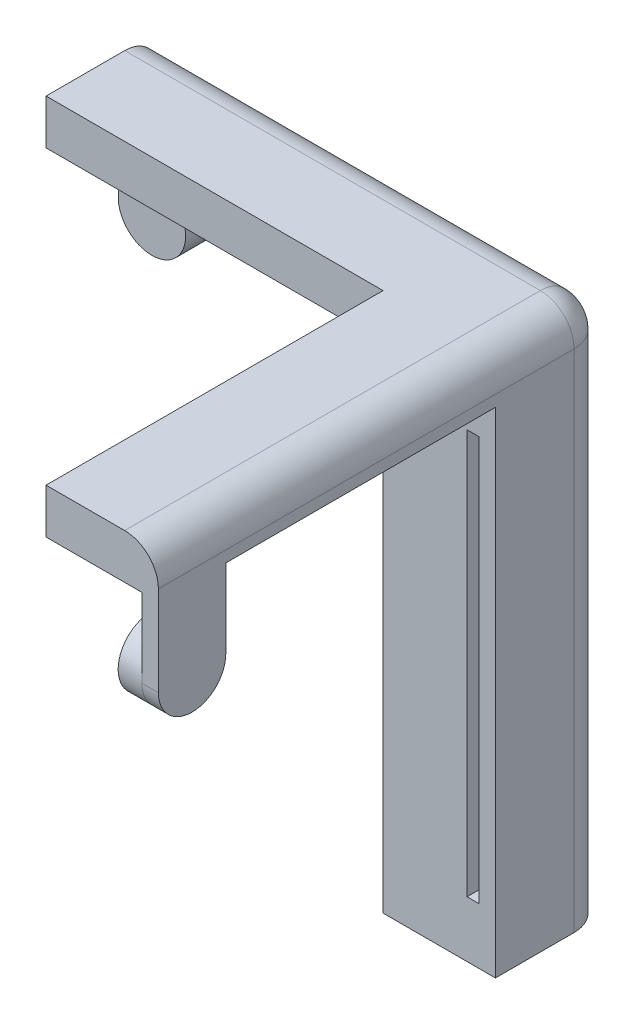
ISO-10303-21;
HEADER;
FILE_DESCRIPTION(('STEP AP214'),'2;1');
FILE_NAME('part.step','',(''),(''),'','','');
FILE_SCHEMA(('AUTOMOTIVE_DESIGN { 1 0 10303 214 1 1 1 1 }'));
ENDSEC;
DATA;
#1=APPLICATION_CONTEXT('core data for automotive mechanical design processes');
#2=APPLICATION_PROTOCOL_DEFINITION('international standard','automotive_design',2000,#1);
#3=PRODUCT_CONTEXT('',#1,'mechanical');
#4=PRODUCT('Part','Part','',(#3));
#5=PRODUCT_RELATED_PRODUCT_CATEGORY('part','',(#4));
#6=PRODUCT_DEFINITION_FORMATION('','',#4);
#7=PRODUCT_DEFINITION_CONTEXT('part definition',#1,'design');
#8=PRODUCT_DEFINITION('design','',#6,#7);
#9=PRODUCT_DEFINITION_SHAPE('','',#8);
#10=(LENGTH_UNIT() NAMED_UNIT(*) SI_UNIT(.MILLI.,.METRE.));
#11=(NAMED_UNIT(*) PLANE_ANGLE_UNIT() SI_UNIT($,.RADIAN.));
#12=(NAMED_UNIT(*) SI_UNIT($,.STERADIAN.) SOLID_ANGLE_UNIT());
#13=UNCERTAINTY_MEASURE_WITH_UNIT(LENGTH_MEASURE(1.E-05),#10,'distance_accuracy_value','');
#14=(GEOMETRIC_REPRESENTATION_CONTEXT(3) GLOBAL_UNCERTAINTY_ASSIGNED_CONTEXT((#13)) GLOBAL_UNIT_ASSIGNED_CONTEXT((#10,
#11,#12)) REPRESENTATION_CONTEXT('',''));
#15=CARTESIAN_POINT('',(0.,0.,0.));
#16=DIRECTION('',(0.,0.,1.));
#17=DIRECTION('',(1.,0.,0.));
#18=AXIS2_PLACEMENT_3D('',#15,#16,#17);
#19=CARTESIAN_POINT('',(0.,139.7,0.));
#20=DIRECTION('',(0.,1.,0.));
#21=DIRECTION('',(0.,0.,1.));
#22=AXIS2_PLACEMENT_3D('',#19,#20,#21);
#23=PLANE('',#22);
#24=DIRECTION('',(-1.,0.,0.));
#25=VECTOR('',#24,1.);
#26=CARTESIAN_POINT('',(-25.4,139.7,-15.875));
#27=LINE('',#26,#25);
#28=CARTESIAN_POINT('',(-3.175,139.7,-15.875));
#29=VERTEX_POINT('',#28);
#30=CARTESIAN_POINT('',(-25.4,139.7,-15.875));
#31=VERTEX_POINT('',#30);
#32=EDGE_CURVE('E295',#29,#31,#27,.T.);
#33=ORIENTED_EDGE('',*,*,#32,.F.);
#34=CARTESIAN_POINT('',(-3.175,139.7,-6.35));
#35=DIRECTION('',(0.,1.,0.));
#36=DIRECTION('',(0.,0.,1.));
#37=AXIS2_PLACEMENT_3D('',#34,#35,#36);
#38=CIRCLE('',#37,9.525);
#39=CARTESIAN_POINT('',(6.35,139.7,-6.35));
#40=VERTEX_POINT('',#39);
#41=EDGE_CURVE('E11',#29,#40,#38,.F.);
#42=ORIENTED_EDGE('',*,*,#41,.T.);
#43=DIRECTION('',(0.,0.,1.));
#44=VECTOR('',#43,1.);
#45=CARTESIAN_POINT('',(6.35,139.7,0.));
#46=LINE('',#45,#44);
#47=CARTESIAN_POINT('',(6.35,139.7,15.875));
#48=VERTEX_POINT('',#47);
#49=EDGE_CURVE('E42',#40,#48,#46,.T.);
#50=ORIENTED_EDGE('',*,*,#49,.T.);
#51=DIRECTION('',(1.,0.,0.));
#52=VECTOR('',#51,1.);
#53=CARTESIAN_POINT('',(-25.4,139.7,15.875));
#54=LINE('',#53,#52);
#55=CARTESIAN_POINT('',(-25.4,139.7,15.875));
#56=VERTEX_POINT('',#55);
#57=EDGE_CURVE('E296',#56,#48,#54,.T.);
#58=ORIENTED_EDGE('',*,*,#57,.F.);
#59=DIRECTION('',(0.,0.,1.));
#60=VECTOR('',#59,1.);
#61=CARTESIAN_POINT('',(-25.4,139.7,15.875));
#62=LINE('',#61,#60);
#63=EDGE_CURVE('E37',#31,#56,#62,.T.);
#64=ORIENTED_EDGE('',*,*,#63,.F.);
#65=EDGE_LOOP('',(#33,#42,#50,#58,#64));
#66=FACE_BOUND('',#65,.T.);
#67=ADVANCED_FACE('F34',(#66),#23,.F.);
#68=CARTESIAN_POINT('',(-25.4,279.4,-15.875));
#69=DIRECTION('',(0.,0.,1.));
#70=DIRECTION('',(1.,0.,0.));
#71=AXIS2_PLACEMENT_3D('',#68,#69,#70);
#72=PLANE('',#71);
#73=DIRECTION('',(0.,1.,0.));
#74=VECTOR('',#73,1.);
#75=CARTESIAN_POINT('',(-3.175,0.,-15.875));
#76=LINE('',#75,#74);
#77=CARTESIAN_POINT('',(-3.175,282.575,-15.875));
#78=VERTEX_POINT('',#77);
#79=EDGE_CURVE('E275',#78,#29,#76,.F.);
#80=ORIENTED_EDGE('',*,*,#79,.T.);
#81=ORIENTED_EDGE('',*,*,#32,.T.);
#82=DIRECTION('',(0.,-1.,0.));
#83=VECTOR('',#82,1.);
#84=CARTESIAN_POINT('',(-25.4,279.4,-15.875));
#85=LINE('',#84,#83);
#86=CARTESIAN_POINT('',(-25.4,279.4,-15.875));
#87=VERTEX_POINT('',#86);
#88=EDGE_CURVE('E302',#87,#31,#85,.T.);
#89=ORIENTED_EDGE('',*,*,#88,.F.);
#90=DIRECTION('',(-1.,0.,0.));
#91=VECTOR('',#90,1.);
#92=CARTESIAN_POINT('',(0.,279.4,-15.875));
#93=LINE('',#92,#91);
#94=CARTESIAN_POINT('',(-101.6,279.4,-15.875));
#95=VERTEX_POINT('',#94);
#96=EDGE_CURVE('E381',#87,#95,#93,.T.);
#97=ORIENTED_EDGE('',*,*,#96,.T.);
#98=DIRECTION('',(0.,-1.,0.));
#99=VECTOR('',#98,1.);
#100=CARTESIAN_POINT('',(-101.6,279.4,-15.875));
#101=LINE('',#100,#99);
#102=CARTESIAN_POINT('',(-101.6,257.175,-15.875));
#103=VERTEX_POINT('',#102);
#104=EDGE_CURVE('E249',#95,#103,#101,.T.);
#105=ORIENTED_EDGE('',*,*,#104,.T.);
#106=CARTESIAN_POINT('',(-111.125,257.175,-15.875));
#107=DIRECTION('',(0.,0.,1.));
#108=DIRECTION('',(1.,0.,0.));
#109=AXIS2_PLACEMENT_3D('',#106,#107,#108);
#110=CIRCLE('',#109,9.525);
#111=CARTESIAN_POINT('',(-111.125,247.65,-15.875));
#112=VERTEX_POINT('',#111);
#113=EDGE_CURVE('E229',#103,#112,#110,.F.);
#114=ORIENTED_EDGE('',*,*,#113,.T.);
#115=CARTESIAN_POINT('',(-111.125,257.175,-15.875));
#116=DIRECTION('',(0.,0.,1.));
#117=DIRECTION('',(1.,0.,0.));
#118=AXIS2_PLACEMENT_3D('',#115,#116,#117);
#119=CIRCLE('',#118,9.525);
#120=CARTESIAN_POINT('',(-120.65,257.175,-15.875));
#121=VERTEX_POINT('',#120);
#122=EDGE_CURVE('E264',#112,#121,#119,.F.);
#123=ORIENTED_EDGE('',*,*,#122,.T.);
#124=DIRECTION('',(0.,-1.,0.));
#125=VECTOR('',#124,1.);
#126=CARTESIAN_POINT('',(-120.65,292.1,-15.875));
#127=LINE('',#126,#125);
#128=CARTESIAN_POINT('',(-120.65,282.575,-15.875));
#129=VERTEX_POINT('',#128);
#130=EDGE_CURVE('E223',#129,#121,#127,.T.);
#131=ORIENTED_EDGE('',*,*,#130,.F.);
#132=DIRECTION('',(-1.,0.,0.));
#133=VECTOR('',#132,1.);
#134=CARTESIAN_POINT('',(6.35,282.575,-15.875));
#135=LINE('',#134,#133);
#136=EDGE_CURVE('E278',#129,#78,#135,.F.);
#137=ORIENTED_EDGE('',*,*,#136,.T.);
#138=EDGE_LOOP('',(#80,#81,#89,#97,#105,#114,#123,#131,#137));
#139=FACE_BOUND('',#138,.T.);
#140=ADVANCED_FACE('F300',(#139),#72,.F.);
#141=CARTESIAN_POINT('',(-25.4,279.4,15.875));
#142=DIRECTION('',(0.,0.,-1.));
#143=DIRECTION('',(-1.,0.,0.));
#144=AXIS2_PLACEMENT_3D('',#141,#142,#143);
#145=PLANE('',#144);
#146=DIRECTION('',(-1.,0.,0.));
#147=VECTOR('',#146,1.);
#148=CARTESIAN_POINT('',(-1.67640000000002,269.875,15.875));
#149=LINE('',#148,#147);
#150=CARTESIAN_POINT('',(1.67640000000002,269.875,15.875));
#151=VERTEX_POINT('',#150);
#152=CARTESIAN_POINT('',(-1.67640000000002,269.875,15.875));
#153=VERTEX_POINT('',#152);
#154=EDGE_CURVE('E452',#151,#153,#149,.T.);
#155=ORIENTED_EDGE('',*,*,#154,.F.);
#156=DIRECTION('',(0.,1.,0.));
#157=VECTOR('',#156,1.);
#158=CARTESIAN_POINT('',(1.67640000000002,155.575,15.875));
#159=LINE('',#158,#157);
#160=CARTESIAN_POINT('',(1.67640000000002,155.575,15.875));
#161=VERTEX_POINT('',#160);
#162=EDGE_CURVE('E436',#161,#151,#159,.T.);
#163=ORIENTED_EDGE('',*,*,#162,.F.);
#164=DIRECTION('',(1.,0.,0.));
#165=VECTOR('',#164,1.);
#166=CARTESIAN_POINT('',(-1.67639999999998,155.575,15.875));
#167=LINE('',#166,#165);
#168=CARTESIAN_POINT('',(-1.67639999999998,155.575,15.875));
#169=VERTEX_POINT('',#168);
#170=EDGE_CURVE('E441',#169,#161,#167,.T.);
#171=ORIENTED_EDGE('',*,*,#170,.F.);
#172=DIRECTION('',(0.,-1.,0.));
#173=VECTOR('',#172,1.);
#174=CARTESIAN_POINT('',(-1.67639999999998,155.575,15.875));
#175=LINE('',#174,#173);
#176=EDGE_CURVE('E455',#153,#169,#175,.T.);
#177=ORIENTED_EDGE('',*,*,#176,.F.);
#178=EDGE_LOOP('',(#155,#163,#171,#177));
#179=FACE_BOUND('',#178,.T.);
#180=DIRECTION('',(0.,-1.,0.));
#181=VECTOR('',#180,1.);
#182=CARTESIAN_POINT('',(-25.4,279.4,15.875));
#183=LINE('',#182,#181);
#184=CARTESIAN_POINT('',(-25.4,279.4,15.875));
#185=VERTEX_POINT('',#184);
#186=EDGE_CURVE('E312',#185,#56,#183,.T.);
#187=ORIENTED_EDGE('',*,*,#186,.T.);
#188=ORIENTED_EDGE('',*,*,#57,.T.);
#189=DIRECTION('',(0.,-1.,0.));
#190=VECTOR('',#189,1.);
#191=CARTESIAN_POINT('',(6.35,279.4,15.875));
#192=LINE('',#191,#190);
#193=CARTESIAN_POINT('',(6.35,279.4,15.875));
#194=VERTEX_POINT('',#193);
#195=EDGE_CURVE('E428',#194,#48,#192,.T.);
#196=ORIENTED_EDGE('',*,*,#195,.F.);
#197=DIRECTION('',(1.,0.,0.));
#198=VECTOR('',#197,1.);
#199=CARTESIAN_POINT('',(-25.4,279.4,15.875));
#200=LINE('',#199,#198);
#201=EDGE_CURVE('E318',#185,#194,#200,.T.);
#202=ORIENTED_EDGE('',*,*,#201,.F.);
#203=EDGE_LOOP('',(#187,#188,#196,#202));
#204=FACE_BOUND('',#203,.T.);
#205=ADVANCED_FACE('F521',(#179,#204),#145,.F.);
#206=CARTESIAN_POINT('',(-25.4,279.4,15.875));
#207=DIRECTION('',(1.,0.,0.));
#208=DIRECTION('',(0.,0.,-1.));
#209=AXIS2_PLACEMENT_3D('',#206,#207,#208);
#210=PLANE('',#209);
#211=DIRECTION('',(0.,0.,1.));
#212=VECTOR('',#211,1.);
#213=CARTESIAN_POINT('',(-25.4,155.575,-11.2014));
#214=LINE('',#213,#212);
#215=CARTESIAN_POINT('',(-25.4,155.575,-11.2014));
#216=VERTEX_POINT('',#215);
#217=CARTESIAN_POINT('',(-25.4,155.575,-7.84859999999999));
#218=VERTEX_POINT('',#217);
#219=EDGE_CURVE('E418',#216,#218,#214,.T.);
#220=ORIENTED_EDGE('',*,*,#219,.F.);
#221=DIRECTION('',(0.,-1.,0.));
#222=VECTOR('',#221,1.);
#223=CARTESIAN_POINT('',(-25.4,269.875,-11.2014));
#224=LINE('',#223,#222);
#225=CARTESIAN_POINT('',(-25.4,269.875,-11.2014));
#226=VERTEX_POINT('',#225);
#227=EDGE_CURVE('E402',#226,#216,#224,.T.);
#228=ORIENTED_EDGE('',*,*,#227,.F.);
#229=DIRECTION('',(0.,0.,-1.));
#230=VECTOR('',#229,1.);
#231=CARTESIAN_POINT('',(-25.4,269.875,-11.2014));
#232=LINE('',#231,#230);
#233=CARTESIAN_POINT('',(-25.4,269.875,-7.8486));
#234=VERTEX_POINT('',#233);
#235=EDGE_CURVE('E407',#234,#226,#232,.T.);
#236=ORIENTED_EDGE('',*,*,#235,.F.);
#237=DIRECTION('',(0.,1.,0.));
#238=VECTOR('',#237,1.);
#239=CARTESIAN_POINT('',(-25.4,269.875,-7.8486));
#240=LINE('',#239,#238);
#241=EDGE_CURVE('E421',#218,#234,#240,.T.);
#242=ORIENTED_EDGE('',*,*,#241,.F.);
#243=EDGE_LOOP('',(#220,#228,#236,#242));
#244=FACE_BOUND('',#243,.T.);
#245=ORIENTED_EDGE('',*,*,#88,.T.);
#246=ORIENTED_EDGE('',*,*,#63,.T.);
#247=ORIENTED_EDGE('',*,*,#186,.F.);
#248=DIRECTION('',(0.,0.,1.));
#249=VECTOR('',#248,1.);
#250=CARTESIAN_POINT('',(-25.4,279.4,15.875));
#251=LINE('',#250,#249);
#252=EDGE_CURVE('E309',#87,#185,#251,.T.);
#253=ORIENTED_EDGE('',*,*,#252,.F.);
#254=EDGE_LOOP('',(#245,#246,#247,#253));
#255=FACE_BOUND('',#254,.T.);
#256=ADVANCED_FACE('F306',(#244,#255),#210,.F.);
#257=CARTESIAN_POINT('',(1.67640000000002,155.575,3.175));
#258=DIRECTION('',(1.,0.,0.));
#259=DIRECTION('',(0.,1.,0.));
#260=AXIS2_PLACEMENT_3D('',#257,#258,#259);
#261=PLANE('',#260);
#262=ORIENTED_EDGE('',*,*,#162,.T.);
#263=DIRECTION('',(0.,0.,1.));
#264=VECTOR('',#263,1.);
#265=CARTESIAN_POINT('',(1.67640000000002,269.875,3.175));
#266=LINE('',#265,#264);
#267=CARTESIAN_POINT('',(1.67640000000002,269.875,3.175));
#268=VERTEX_POINT('',#267);
#269=EDGE_CURVE('E450',#268,#151,#266,.T.);
#270=ORIENTED_EDGE('',*,*,#269,.F.);
#271=DIRECTION('',(0.,1.,0.));
#272=VECTOR('',#271,1.);
#273=CARTESIAN_POINT('',(1.67640000000002,155.575,3.175));
#274=LINE('',#273,#272);
#275=CARTESIAN_POINT('',(1.67640000000002,155.575,3.175));
#276=VERTEX_POINT('',#275);
#277=EDGE_CURVE('E437',#276,#268,#274,.T.);
#278=ORIENTED_EDGE('',*,*,#277,.F.);
#279=DIRECTION('',(0.,0.,1.));
#280=VECTOR('',#279,1.);
#281=CARTESIAN_POINT('',(1.67640000000002,155.575,3.175));
#282=LINE('',#281,#280);
#283=EDGE_CURVE('E460',#276,#161,#282,.T.);
#284=ORIENTED_EDGE('',*,*,#283,.T.);
#285=EDGE_LOOP('',(#262,#270,#278,#284));
#286=FACE_BOUND('',#285,.T.);
#287=ADVANCED_FACE('F559',(#286),#261,.F.);
#288=CARTESIAN_POINT('',(-1.67639999999998,155.575,3.175));
#289=DIRECTION('',(0.,-1.,0.));
#290=DIRECTION('',(0.,0.,-1.));
#291=AXIS2_PLACEMENT_3D('',#288,#289,#290);
#292=PLANE('',#291);
#293=ORIENTED_EDGE('',*,*,#170,.T.);
#294=ORIENTED_EDGE('',*,*,#283,.F.);
#295=DIRECTION('',(1.,0.,0.));
#296=VECTOR('',#295,1.);
#297=CARTESIAN_POINT('',(-1.67639999999998,155.575,3.175));
#298=LINE('',#297,#296);
#299=CARTESIAN_POINT('',(-1.67639999999998,155.575,3.175));
#300=VERTEX_POINT('',#299);
#301=EDGE_CURVE('E447',#300,#276,#298,.T.);
#302=ORIENTED_EDGE('',*,*,#301,.F.);
#303=DIRECTION('',(0.,0.,1.));
#304=VECTOR('',#303,1.);
#305=CARTESIAN_POINT('',(-1.67639999999998,155.575,3.175));
#306=LINE('',#305,#304);
#307=EDGE_CURVE('E462',#300,#169,#306,.T.);
#308=ORIENTED_EDGE('',*,*,#307,.T.);
#309=EDGE_LOOP('',(#293,#294,#302,#308));
#310=FACE_BOUND('',#309,.T.);
#311=ADVANCED_FACE('F566',(#310),#292,.F.);
#312=CARTESIAN_POINT('',(-1.67639999999998,155.575,3.175));
#313=DIRECTION('',(-1.,0.,0.));
#314=DIRECTION('',(0.,-1.,0.));
#315=AXIS2_PLACEMENT_3D('',#312,#313,#314);
#316=PLANE('',#315);
#317=ORIENTED_EDGE('',*,*,#176,.T.);
#318=ORIENTED_EDGE('',*,*,#307,.F.);
#319=DIRECTION('',(0.,-1.,0.));
#320=VECTOR('',#319,1.);
#321=CARTESIAN_POINT('',(-1.67639999999998,155.575,3.175));
#322=LINE('',#321,#320);
#323=CARTESIAN_POINT('',(-1.67640000000002,269.875,3.175));
#324=VERTEX_POINT('',#323);
#325=EDGE_CURVE('E444',#324,#300,#322,.T.);
#326=ORIENTED_EDGE('',*,*,#325,.F.);
#327=DIRECTION('',(0.,0.,1.));
#328=VECTOR('',#327,1.);
#329=CARTESIAN_POINT('',(-1.67640000000002,269.875,3.175));
#330=LINE('',#329,#328);
#331=EDGE_CURVE('E464',#324,#153,#330,.T.);
#332=ORIENTED_EDGE('',*,*,#331,.T.);
#333=EDGE_LOOP('',(#317,#318,#326,#332));
#334=FACE_BOUND('',#333,.T.);
#335=ADVANCED_FACE('F572',(#334),#316,.F.);
#336=CARTESIAN_POINT('',(-1.67640000000002,269.875,3.175));
#337=DIRECTION('',(0.,1.,0.));
#338=DIRECTION('',(0.,0.,1.));
#339=AXIS2_PLACEMENT_3D('',#336,#337,#338);
#340=PLANE('',#339);
#341=ORIENTED_EDGE('',*,*,#154,.T.);
#342=ORIENTED_EDGE('',*,*,#331,.F.);
#343=DIRECTION('',(-1.,0.,0.));
#344=VECTOR('',#343,1.);
#345=CARTESIAN_POINT('',(-1.67640000000002,269.875,3.175));
#346=LINE('',#345,#344);
#347=EDGE_CURVE('E440',#268,#324,#346,.T.);
#348=ORIENTED_EDGE('',*,*,#347,.F.);
#349=ORIENTED_EDGE('',*,*,#269,.T.);
#350=EDGE_LOOP('',(#341,#342,#348,#349));
#351=FACE_BOUND('',#350,.T.);
#352=ADVANCED_FACE('F568',(#351),#340,.F.);
#353=CARTESIAN_POINT('',(0.,0.,3.175));
#354=DIRECTION('',(0.,0.,-1.));
#355=DIRECTION('',(-1.,0.,0.));
#356=AXIS2_PLACEMENT_3D('',#353,#354,#355);
#357=PLANE('',#356);
#358=ORIENTED_EDGE('',*,*,#277,.T.);
#359=ORIENTED_EDGE('',*,*,#347,.T.);
#360=ORIENTED_EDGE('',*,*,#325,.T.);
#361=ORIENTED_EDGE('',*,*,#301,.T.);
#362=EDGE_LOOP('',(#358,#359,#360,#361));
#363=FACE_BOUND('',#362,.T.);
#364=ADVANCED_FACE('F571',(#363),#357,.F.);
#365=CARTESIAN_POINT('',(6.35,0.,0.));
#366=DIRECTION('',(1.,0.,0.));
#367=DIRECTION('',(0.,0.,-1.));
#368=AXIS2_PLACEMENT_3D('',#365,#366,#367);
#369=PLANE('',#368);
#370=ORIENTED_EDGE('',*,*,#49,.F.);
#371=DIRECTION('',(0.,1.,0.));
#372=VECTOR('',#371,1.);
#373=CARTESIAN_POINT('',(6.35,292.1,-6.35));
#374=LINE('',#373,#372);
#375=CARTESIAN_POINT('',(6.35,282.575,-6.35));
#376=VERTEX_POINT('',#375);
#377=EDGE_CURVE('E280',#40,#376,#374,.T.);
#378=ORIENTED_EDGE('',*,*,#377,.T.);
#379=DIRECTION('',(0.,0.,1.));
#380=VECTOR('',#379,1.);
#381=CARTESIAN_POINT('',(6.35,282.575,0.));
#382=LINE('',#381,#380);
#383=CARTESIAN_POINT('',(6.35000000000001,282.575,111.145003851853));
#384=VERTEX_POINT('',#383);
#385=EDGE_CURVE('E282',#376,#384,#382,.T.);
#386=ORIENTED_EDGE('',*,*,#385,.T.);
#387=DIRECTION('',(0.,-1.,0.));
#388=VECTOR('',#387,1.);
#389=CARTESIAN_POINT('',(6.35000000000001,292.1,111.145003851853));
#390=LINE('',#389,#388);
#391=CARTESIAN_POINT('',(6.35000000000001,257.175,111.145003851853));
#392=VERTEX_POINT('',#391);
#393=EDGE_CURVE('E378',#384,#392,#390,.T.);
#394=ORIENTED_EDGE('',*,*,#393,.T.);
#395=CARTESIAN_POINT('',(6.35,257.175,101.620003851853));
#396=DIRECTION('',(1.,0.,0.));
#397=DIRECTION('',(0.,0.,-1.));
#398=AXIS2_PLACEMENT_3D('',#395,#396,#397);
#399=CIRCLE('',#398,9.525);
#400=CARTESIAN_POINT('',(6.35,247.65,101.620003851853));
#401=VERTEX_POINT('',#400);
#402=EDGE_CURVE('E322',#392,#401,#399,.T.);
#403=ORIENTED_EDGE('',*,*,#402,.T.);
#404=CARTESIAN_POINT('',(6.35,257.175,101.620003851853));
#405=DIRECTION('',(1.,0.,0.));
#406=DIRECTION('',(0.,0.,-1.));
#407=AXIS2_PLACEMENT_3D('',#404,#405,#406);
#408=CIRCLE('',#407,9.525);
#409=CARTESIAN_POINT('',(6.35,257.175,92.0950038518526));
#410=VERTEX_POINT('',#409);
#411=EDGE_CURVE('E324',#401,#410,#408,.T.);
#412=ORIENTED_EDGE('',*,*,#411,.T.);
#413=DIRECTION('',(0.,1.,0.));
#414=VECTOR('',#413,1.);
#415=CARTESIAN_POINT('',(6.35,279.4,92.0950038518526));
#416=LINE('',#415,#414);
#417=CARTESIAN_POINT('',(6.35,279.4,92.0950038518526));
#418=VERTEX_POINT('',#417);
#419=EDGE_CURVE('E335',#410,#418,#416,.T.);
#420=ORIENTED_EDGE('',*,*,#419,.T.);
#421=DIRECTION('',(0.,0.,1.));
#422=VECTOR('',#421,1.);
#423=CARTESIAN_POINT('',(6.35,279.4,0.));
#424=LINE('',#423,#422);
#425=EDGE_CURVE('E366',#194,#418,#424,.T.);
#426=ORIENTED_EDGE('',*,*,#425,.F.);
#427=ORIENTED_EDGE('',*,*,#195,.T.);
#428=EDGE_LOOP('',(#370,#378,#386,#394,#403,#412,#420,#426,#427));
#429=FACE_BOUND('',#428,.T.);
#430=ADVANCED_FACE('F474',(#429),#369,.T.);
#431=CARTESIAN_POINT('',(-12.7,269.875,-11.2014));
#432=DIRECTION('',(0.,0.,-1.));
#433=DIRECTION('',(0.,1.,0.));
#434=AXIS2_PLACEMENT_3D('',#431,#432,#433);
#435=PLANE('',#434);
#436=ORIENTED_EDGE('',*,*,#227,.T.);
#437=DIRECTION('',(-1.,0.,0.));
#438=VECTOR('',#437,1.);
#439=CARTESIAN_POINT('',(-12.7,155.575,-11.2014));
#440=LINE('',#439,#438);
#441=CARTESIAN_POINT('',(-12.7,155.575,-11.2014));
#442=VERTEX_POINT('',#441);
#443=EDGE_CURVE('E416',#442,#216,#440,.T.);
#444=ORIENTED_EDGE('',*,*,#443,.F.);
#445=DIRECTION('',(0.,-1.,0.));
#446=VECTOR('',#445,1.);
#447=CARTESIAN_POINT('',(-12.7,269.875,-11.2014));
#448=LINE('',#447,#446);
#449=CARTESIAN_POINT('',(-12.7,269.875,-11.2014));
#450=VERTEX_POINT('',#449);
#451=EDGE_CURVE('E403',#450,#442,#448,.T.);
#452=ORIENTED_EDGE('',*,*,#451,.F.);
#453=DIRECTION('',(-1.,0.,0.));
#454=VECTOR('',#453,1.);
#455=CARTESIAN_POINT('',(-12.7,269.875,-11.2014));
#456=LINE('',#455,#454);
#457=EDGE_CURVE('E426',#450,#226,#456,.T.);
#458=ORIENTED_EDGE('',*,*,#457,.T.);
#459=EDGE_LOOP('',(#436,#444,#452,#458));
#460=FACE_BOUND('',#459,.T.);
#461=ADVANCED_FACE('F584',(#460),#435,.F.);
#462=CARTESIAN_POINT('',(-12.7,269.875,-11.2014));
#463=DIRECTION('',(0.,1.,0.));
#464=DIRECTION('',(0.,0.,1.));
#465=AXIS2_PLACEMENT_3D('',#462,#463,#464);
#466=PLANE('',#465);
#467=ORIENTED_EDGE('',*,*,#235,.T.);
#468=ORIENTED_EDGE('',*,*,#457,.F.);
#469=DIRECTION('',(0.,0.,-1.));
#470=VECTOR('',#469,1.);
#471=CARTESIAN_POINT('',(-12.7,269.875,-11.2014));
#472=LINE('',#471,#470);
#473=CARTESIAN_POINT('',(-12.7,269.875,-7.8486));
#474=VERTEX_POINT('',#473);
#475=EDGE_CURVE('E413',#474,#450,#472,.T.);
#476=ORIENTED_EDGE('',*,*,#475,.F.);
#477=DIRECTION('',(-1.,0.,0.));
#478=VECTOR('',#477,1.);
#479=CARTESIAN_POINT('',(-12.7,269.875,-7.8486));
#480=LINE('',#479,#478);
#481=EDGE_CURVE('E429',#474,#234,#480,.T.);
#482=ORIENTED_EDGE('',*,*,#481,.T.);
#483=EDGE_LOOP('',(#467,#468,#476,#482));
#484=FACE_BOUND('',#483,.T.);
#485=ADVANCED_FACE('F587',(#484),#466,.F.);
#486=CARTESIAN_POINT('',(-12.7,269.875,-7.8486));
#487=DIRECTION('',(0.,0.,1.));
#488=DIRECTION('',(0.,-1.,0.));
#489=AXIS2_PLACEMENT_3D('',#486,#487,#488);
#490=PLANE('',#489);
#491=ORIENTED_EDGE('',*,*,#241,.T.);
#492=ORIENTED_EDGE('',*,*,#481,.F.);
#493=DIRECTION('',(0.,1.,0.));
#494=VECTOR('',#493,1.);
#495=CARTESIAN_POINT('',(-12.7,269.875,-7.8486));
#496=LINE('',#495,#494);
#497=CARTESIAN_POINT('',(-12.7,155.575,-7.84859999999999));
#498=VERTEX_POINT('',#497);
#499=EDGE_CURVE('E410',#498,#474,#496,.T.);
#500=ORIENTED_EDGE('',*,*,#499,.F.);
#501=DIRECTION('',(-1.,0.,0.));
#502=VECTOR('',#501,1.);
#503=CARTESIAN_POINT('',(-12.7,155.575,-7.84859999999999));
#504=LINE('',#503,#502);
#505=EDGE_CURVE('E431',#498,#218,#504,.T.);
#506=ORIENTED_EDGE('',*,*,#505,.T.);
#507=EDGE_LOOP('',(#491,#492,#500,#506));
#508=FACE_BOUND('',#507,.T.);
#509=ADVANCED_FACE('F593',(#508),#490,.F.);
#510=CARTESIAN_POINT('',(-12.7,155.575,-11.2014));
#511=DIRECTION('',(0.,-1.,0.));
#512=DIRECTION('',(0.,0.,-1.));
#513=AXIS2_PLACEMENT_3D('',#510,#511,#512);
#514=PLANE('',#513);
#515=ORIENTED_EDGE('',*,*,#219,.T.);
#516=ORIENTED_EDGE('',*,*,#505,.F.);
#517=DIRECTION('',(0.,0.,1.));
#518=VECTOR('',#517,1.);
#519=CARTESIAN_POINT('',(-12.7,155.575,-11.2014));
#520=LINE('',#519,#518);
#521=EDGE_CURVE('E406',#442,#498,#520,.T.);
#522=ORIENTED_EDGE('',*,*,#521,.F.);
#523=ORIENTED_EDGE('',*,*,#443,.T.);
#524=EDGE_LOOP('',(#515,#516,#522,#523));
#525=FACE_BOUND('',#524,.T.);
#526=ADVANCED_FACE('F589',(#525),#514,.F.);
#527=CARTESIAN_POINT('',(-12.7,0.,0.));
#528=DIRECTION('',(-1.,0.,0.));
#529=DIRECTION('',(0.,0.,1.));
#530=AXIS2_PLACEMENT_3D('',#527,#528,#529);
#531=PLANE('',#530);
#532=ORIENTED_EDGE('',*,*,#451,.T.);
#533=ORIENTED_EDGE('',*,*,#521,.T.);
#534=ORIENTED_EDGE('',*,*,#499,.T.);
#535=ORIENTED_EDGE('',*,*,#475,.T.);
#536=EDGE_LOOP('',(#532,#533,#534,#535));
#537=FACE_BOUND('',#536,.T.);
#538=ADVANCED_FACE('F592',(#537),#531,.T.);
#539=CARTESIAN_POINT('',(0.,279.4,0.));
#540=DIRECTION('',(0.,1.,0.));
#541=DIRECTION('',(0.,0.,1.));
#542=AXIS2_PLACEMENT_3D('',#539,#540,#541);
#543=PLANE('',#542);
#544=DIRECTION('',(1.,0.,0.));
#545=VECTOR('',#544,1.);
#546=CARTESIAN_POINT('',(-120.65,279.4,-11.2014));
#547=LINE('',#546,#545);
#548=CARTESIAN_POINT('',(-120.65,279.4,-11.2014));
#549=VERTEX_POINT('',#548);
#550=CARTESIAN_POINT('',(-101.6,279.4,-11.2014));
#551=VERTEX_POINT('',#550);
#552=EDGE_CURVE('E247',#549,#551,#547,.T.);
#553=ORIENTED_EDGE('',*,*,#552,.T.);
#554=DIRECTION('',(0.,0.,-1.));
#555=VECTOR('',#554,1.);
#556=CARTESIAN_POINT('',(-101.6,279.4,-11.2014));
#557=LINE('',#556,#555);
#558=EDGE_CURVE('E358',#551,#95,#557,.T.);
#559=ORIENTED_EDGE('',*,*,#558,.T.);
#560=ORIENTED_EDGE('',*,*,#96,.F.);
#561=ORIENTED_EDGE('',*,*,#252,.T.);
#562=ORIENTED_EDGE('',*,*,#201,.T.);
#563=ORIENTED_EDGE('',*,*,#425,.T.);
#564=DIRECTION('',(1.,0.,0.));
#565=VECTOR('',#564,1.);
#566=CARTESIAN_POINT('',(1.6764,279.4,92.0950038518526));
#567=LINE('',#566,#565);
#568=CARTESIAN_POINT('',(1.6764,279.4,92.0950038518526));
#569=VERTEX_POINT('',#568);
#570=EDGE_CURVE('E363',#569,#418,#567,.T.);
#571=ORIENTED_EDGE('',*,*,#570,.F.);
#572=DIRECTION('',(0.,0.,1.));
#573=VECTOR('',#572,1.);
#574=CARTESIAN_POINT('',(1.6764,279.4,111.145003851853));
#575=LINE('',#574,#573);
#576=CARTESIAN_POINT('',(1.6764,279.4,111.145003851853));
#577=VERTEX_POINT('',#576);
#578=EDGE_CURVE('E346',#569,#577,#575,.T.);
#579=ORIENTED_EDGE('',*,*,#578,.T.);
#580=DIRECTION('',(-1.,0.,0.));
#581=VECTOR('',#580,1.);
#582=CARTESIAN_POINT('',(0.,279.4,111.145003851853));
#583=LINE('',#582,#581);
#584=CARTESIAN_POINT('',(-25.4,279.4,111.145003851853));
#585=VERTEX_POINT('',#584);
#586=EDGE_CURVE('E370',#577,#585,#583,.T.);
#587=ORIENTED_EDGE('',*,*,#586,.T.);
#588=DIRECTION('',(0.,0.,1.));
#589=VECTOR('',#588,1.);
#590=CARTESIAN_POINT('',(-25.4,279.4,0.));
#591=LINE('',#590,#589);
#592=CARTESIAN_POINT('',(-25.4,279.4,15.8950038518526));
#593=VERTEX_POINT('',#592);
#594=EDGE_CURVE('E388',#593,#585,#591,.T.);
#595=ORIENTED_EDGE('',*,*,#594,.F.);
#596=DIRECTION('',(-1.,0.,0.));
#597=VECTOR('',#596,1.);
#598=CARTESIAN_POINT('',(0.,279.4,15.8950038518526));
#599=LINE('',#598,#597);
#600=CARTESIAN_POINT('',(-120.65,279.4,15.8950038518526));
#601=VERTEX_POINT('',#600);
#602=EDGE_CURVE('E385',#593,#601,#599,.T.);
#603=ORIENTED_EDGE('',*,*,#602,.T.);
#604=DIRECTION('',(0.,0.,1.));
#605=VECTOR('',#604,1.);
#606=CARTESIAN_POINT('',(-120.65,279.4,0.));
#607=LINE('',#606,#605);
#608=EDGE_CURVE('E383',#549,#601,#607,.T.);
#609=ORIENTED_EDGE('',*,*,#608,.F.);
#610=EDGE_LOOP('',(#553,#559,#560,#561,#562,#563,#571,#579,#587,#595,#603,#609));
#611=FACE_BOUND('',#610,.T.);
#612=ADVANCED_FACE('F472',(#611),#543,.F.);
#613=CARTESIAN_POINT('',(-120.65,292.1,0.));
#614=DIRECTION('',(1.,0.,0.));
#615=DIRECTION('',(0.,0.,-1.));
#616=AXIS2_PLACEMENT_3D('',#613,#614,#615);
#617=PLANE('',#616);
#618=DIRECTION('',(0.,0.,1.));
#619=VECTOR('',#618,1.);
#620=CARTESIAN_POINT('',(-120.65,292.1,0.));
#621=LINE('',#620,#619);
#622=CARTESIAN_POINT('',(-120.65,292.1,-6.35));
#623=VERTEX_POINT('',#622);
#624=CARTESIAN_POINT('',(-120.65,292.1,15.8950038518526));
#625=VERTEX_POINT('',#624);
#626=EDGE_CURVE('E367',#623,#625,#621,.T.);
#627=ORIENTED_EDGE('',*,*,#626,.F.);
#628=CARTESIAN_POINT('',(-120.65,282.575,-6.35));
#629=DIRECTION('',(1.,0.,0.));
#630=DIRECTION('',(0.,0.,-1.));
#631=AXIS2_PLACEMENT_3D('',#628,#629,#630);
#632=CIRCLE('',#631,9.525);
#633=EDGE_CURVE('E273',#623,#129,#632,.F.);
#634=ORIENTED_EDGE('',*,*,#633,.T.);
#635=ORIENTED_EDGE('',*,*,#130,.T.);
#636=DIRECTION('',(0.,0.,-1.));
#637=VECTOR('',#636,1.);
#638=CARTESIAN_POINT('',(-120.65,257.175,-11.2014));
#639=LINE('',#638,#637);
#640=CARTESIAN_POINT('',(-120.65,257.175,-11.2014));
#641=VERTEX_POINT('',#640);
#642=EDGE_CURVE('E215',#121,#641,#639,.F.);
#643=ORIENTED_EDGE('',*,*,#642,.T.);
#644=DIRECTION('',(0.,1.,0.));
#645=VECTOR('',#644,1.);
#646=CARTESIAN_POINT('',(-120.65,279.4,-11.2014));
#647=LINE('',#646,#645);
#648=EDGE_CURVE('E220',#641,#549,#647,.T.);
#649=ORIENTED_EDGE('',*,*,#648,.T.);
#650=ORIENTED_EDGE('',*,*,#608,.T.);
#651=DIRECTION('',(0.,-1.,0.));
#652=VECTOR('',#651,1.);
#653=CARTESIAN_POINT('',(-120.65,292.1,15.8950038518526));
#654=LINE('',#653,#652);
#655=EDGE_CURVE('E398',#625,#601,#654,.T.);
#656=ORIENTED_EDGE('',*,*,#655,.F.);
#657=EDGE_LOOP('',(#627,#634,#635,#643,#649,#650,#656));
#658=FACE_BOUND('',#657,.T.);
#659=ADVANCED_FACE('F218',(#658),#617,.F.);
#660=CARTESIAN_POINT('',(0.,292.1,15.8950038518526));
#661=DIRECTION('',(0.,0.,1.));
#662=DIRECTION('',(1.,0.,0.));
#663=AXIS2_PLACEMENT_3D('',#660,#661,#662);
#664=PLANE('',#663);
#665=ORIENTED_EDGE('',*,*,#602,.F.);
#666=DIRECTION('',(0.,-1.,0.));
#667=VECTOR('',#666,1.);
#668=CARTESIAN_POINT('',(-25.4,292.1,15.8950038518526));
#669=LINE('',#668,#667);
#670=CARTESIAN_POINT('',(-25.4,292.1,15.8950038518526));
#671=VERTEX_POINT('',#670);
#672=EDGE_CURVE('E396',#671,#593,#669,.T.);
#673=ORIENTED_EDGE('',*,*,#672,.F.);
#674=DIRECTION('',(-1.,0.,0.));
#675=VECTOR('',#674,1.);
#676=CARTESIAN_POINT('',(0.,292.1,15.8950038518526));
#677=LINE('',#676,#675);
#678=EDGE_CURVE('E369',#671,#625,#677,.T.);
#679=ORIENTED_EDGE('',*,*,#678,.T.);
#680=ORIENTED_EDGE('',*,*,#655,.T.);
#681=EDGE_LOOP('',(#665,#673,#679,#680));
#682=FACE_BOUND('',#681,.T.);
#683=ADVANCED_FACE('F489',(#682),#664,.T.);
#684=CARTESIAN_POINT('',(-25.4,292.1,0.));
#685=DIRECTION('',(1.,0.,0.));
#686=DIRECTION('',(0.,0.,-1.));
#687=AXIS2_PLACEMENT_3D('',#684,#685,#686);
#688=PLANE('',#687);
#689=ORIENTED_EDGE('',*,*,#594,.T.);
#690=DIRECTION('',(0.,-1.,0.));
#691=VECTOR('',#690,1.);
#692=CARTESIAN_POINT('',(-25.4,292.1,111.145003851853));
#693=LINE('',#692,#691);
#694=CARTESIAN_POINT('',(-25.4,292.1,111.145003851853));
#695=VERTEX_POINT('',#694);
#696=EDGE_CURVE('E393',#695,#585,#693,.T.);
#697=ORIENTED_EDGE('',*,*,#696,.F.);
#698=DIRECTION('',(0.,0.,1.));
#699=VECTOR('',#698,1.);
#700=CARTESIAN_POINT('',(-25.4,292.1,0.));
#701=LINE('',#700,#699);
#702=EDGE_CURVE('E373',#671,#695,#701,.T.);
#703=ORIENTED_EDGE('',*,*,#702,.F.);
#704=ORIENTED_EDGE('',*,*,#672,.T.);
#705=EDGE_LOOP('',(#689,#697,#703,#704));
#706=FACE_BOUND('',#705,.T.);
#707=ADVANCED_FACE('F608',(#706),#688,.F.);
#708=CARTESIAN_POINT('',(0.,292.1,111.145003851853));
#709=DIRECTION('',(0.,0.,1.));
#710=DIRECTION('',(1.,0.,0.));
#711=AXIS2_PLACEMENT_3D('',#708,#709,#710);
#712=PLANE('',#711);
#713=ORIENTED_EDGE('',*,*,#393,.F.);
#714=CARTESIAN_POINT('',(-3.175,282.575,111.145003851853));
#715=DIRECTION('',(0.,0.,1.));
#716=DIRECTION('',(1.,0.,0.));
#717=AXIS2_PLACEMENT_3D('',#714,#715,#716);
#718=CIRCLE('',#717,9.525);
#719=CARTESIAN_POINT('',(-3.175,292.1,111.145003851853));
#720=VERTEX_POINT('',#719);
#721=EDGE_CURVE('E284',#384,#720,#718,.T.);
#722=ORIENTED_EDGE('',*,*,#721,.T.);
#723=DIRECTION('',(-1.,0.,0.));
#724=VECTOR('',#723,1.);
#725=CARTESIAN_POINT('',(0.,292.1,111.145003851853));
#726=LINE('',#725,#724);
#727=EDGE_CURVE('E376',#720,#695,#726,.T.);
#728=ORIENTED_EDGE('',*,*,#727,.T.);
#729=ORIENTED_EDGE('',*,*,#696,.T.);
#730=ORIENTED_EDGE('',*,*,#586,.F.);
#731=DIRECTION('',(0.,-1.,0.));
#732=VECTOR('',#731,1.);
#733=CARTESIAN_POINT('',(1.6764,279.4,111.145003851853));
#734=LINE('',#733,#732);
#735=CARTESIAN_POINT('',(1.6764,257.175,111.145003851853));
#736=VERTEX_POINT('',#735);
#737=EDGE_CURVE('E347',#577,#736,#734,.T.);
#738=ORIENTED_EDGE('',*,*,#737,.T.);
#739=DIRECTION('',(1.,0.,0.));
#740=VECTOR('',#739,1.);
#741=CARTESIAN_POINT('',(0.,257.175,111.145003851853));
#742=LINE('',#741,#740);
#743=EDGE_CURVE('E253',#736,#392,#742,.T.);
#744=ORIENTED_EDGE('',*,*,#743,.T.);
#745=EDGE_LOOP('',(#713,#722,#728,#729,#730,#738,#744));
#746=FACE_BOUND('',#745,.T.);
#747=ADVANCED_FACE('F482',(#746),#712,.T.);
#748=CARTESIAN_POINT('',(0.,292.1,0.));
#749=DIRECTION('',(0.,1.,0.));
#750=DIRECTION('',(0.,0.,1.));
#751=AXIS2_PLACEMENT_3D('',#748,#749,#750);
#752=PLANE('',#751);
#753=DIRECTION('',(0.,0.,1.));
#754=VECTOR('',#753,1.);
#755=CARTESIAN_POINT('',(-3.175,292.1,0.));
#756=LINE('',#755,#754);
#757=CARTESIAN_POINT('',(-3.175,292.1,-6.35));
#758=VERTEX_POINT('',#757);
#759=EDGE_CURVE('E228',#720,#758,#756,.F.);
#760=ORIENTED_EDGE('',*,*,#759,.T.);
#761=DIRECTION('',(-1.,0.,0.));
#762=VECTOR('',#761,1.);
#763=CARTESIAN_POINT('',(-120.65,292.1,-6.35));
#764=LINE('',#763,#762);
#765=EDGE_CURVE('E270',#758,#623,#764,.T.);
#766=ORIENTED_EDGE('',*,*,#765,.T.);
#767=ORIENTED_EDGE('',*,*,#626,.T.);
#768=ORIENTED_EDGE('',*,*,#678,.F.);
#769=ORIENTED_EDGE('',*,*,#702,.T.);
#770=ORIENTED_EDGE('',*,*,#727,.F.);
#771=EDGE_LOOP('',(#760,#766,#767,#768,#769,#770));
#772=FACE_BOUND('',#771,.T.);
#773=ADVANCED_FACE('F613',(#772),#752,.T.);
#774=CARTESIAN_POINT('',(1.6764,279.4,92.0950038518526));
#775=DIRECTION('',(0.,0.,-1.));
#776=DIRECTION('',(0.,1.,0.));
#777=AXIS2_PLACEMENT_3D('',#774,#775,#776);
#778=PLANE('',#777);
#779=ORIENTED_EDGE('',*,*,#419,.F.);
#780=DIRECTION('',(1.,0.,0.));
#781=VECTOR('',#780,1.);
#782=CARTESIAN_POINT('',(1.6764,257.175,92.0950038518526));
#783=LINE('',#782,#781);
#784=CARTESIAN_POINT('',(1.6764,257.175,92.0950038518526));
#785=VERTEX_POINT('',#784);
#786=EDGE_CURVE('E257',#410,#785,#783,.F.);
#787=ORIENTED_EDGE('',*,*,#786,.T.);
#788=DIRECTION('',(0.,1.,0.));
#789=VECTOR('',#788,1.);
#790=CARTESIAN_POINT('',(1.6764,279.4,92.0950038518526));
#791=LINE('',#790,#789);
#792=EDGE_CURVE('E333',#785,#569,#791,.T.);
#793=ORIENTED_EDGE('',*,*,#792,.T.);
#794=ORIENTED_EDGE('',*,*,#570,.T.);
#795=EDGE_LOOP('',(#779,#787,#793,#794));
#796=FACE_BOUND('',#795,.T.);
#797=ADVANCED_FACE('F331',(#796),#778,.T.);
#798=CARTESIAN_POINT('',(1.6764,0.,0.));
#799=DIRECTION('',(1.,0.,0.));
#800=DIRECTION('',(0.,0.,-1.));
#801=AXIS2_PLACEMENT_3D('',#798,#799,#800);
#802=PLANE('',#801);
#803=CARTESIAN_POINT('',(1.6764,257.175,101.620003851853));
#804=DIRECTION('',(-1.,0.,0.));
#805=DIRECTION('',(0.,0.,1.));
#806=AXIS2_PLACEMENT_3D('',#803,#804,#805);
#807=CIRCLE('',#806,9.52500000000001);
#808=EDGE_CURVE('E343',#736,#785,#807,.T.);
#809=ORIENTED_EDGE('',*,*,#808,.F.);
#810=ORIENTED_EDGE('',*,*,#737,.F.);
#811=ORIENTED_EDGE('',*,*,#578,.F.);
#812=ORIENTED_EDGE('',*,*,#792,.F.);
#813=EDGE_LOOP('',(#809,#810,#811,#812));
#814=FACE_BOUND('',#813,.T.);
#815=ADVANCED_FACE('F341',(#814),#802,.F.);
#816=CARTESIAN_POINT('',(-5.0292,257.175,101.620003851853));
#817=DIRECTION('',(1.,0.,0.));
#818=DIRECTION('',(0.,0.,-1.));
#819=AXIS2_PLACEMENT_3D('',#816,#817,#818);
#820=CYLINDRICAL_SURFACE('',#819,9.52500000000001);
#821=CARTESIAN_POINT('',(-5.0292,257.175,101.620003851853));
#822=DIRECTION('',(-1.,0.,0.));
#823=DIRECTION('',(0.,0.,1.));
#824=AXIS2_PLACEMENT_3D('',#821,#822,#823);
#825=CIRCLE('',#824,9.52500000000001);
#826=CARTESIAN_POINT('',(-5.0292,257.175,111.145003851853));
#827=VERTEX_POINT('',#826);
#828=EDGE_CURVE('E353',#827,#827,#825,.T.);
#829=ORIENTED_EDGE('',*,*,#828,.F.);
#830=EDGE_LOOP('',(#829));
#831=FACE_BOUND('',#830,.T.);
#832=ORIENTED_EDGE('',*,*,#808,.T.);
#833=CARTESIAN_POINT('',(1.6764,257.175,101.620003851853));
#834=DIRECTION('',(1.,0.,0.));
#835=DIRECTION('',(0.,0.,-1.));
#836=AXIS2_PLACEMENT_3D('',#833,#834,#835);
#837=CIRCLE('',#836,9.52500000000001);
#838=CARTESIAN_POINT('',(1.6764,247.65,101.620003851853));
#839=VERTEX_POINT('',#838);
#840=EDGE_CURVE('E315',#785,#839,#837,.F.);
#841=ORIENTED_EDGE('',*,*,#840,.T.);
#842=EDGE_CURVE('E311',#839,#736,#837,.F.);
#843=ORIENTED_EDGE('',*,*,#842,.T.);
#844=EDGE_LOOP('',(#832,#841,#843));
#845=FACE_BOUND('',#844,.T.);
#846=ADVANCED_FACE('F350',(#831,#845),#820,.T.);
#847=CARTESIAN_POINT('',(-5.0292,257.175,101.620003851853));
#848=DIRECTION('',(-1.,0.,0.));
#849=DIRECTION('',(0.,0.,1.));
#850=AXIS2_PLACEMENT_3D('',#847,#848,#849);
#851=PLANE('',#850);
#852=ORIENTED_EDGE('',*,*,#828,.T.);
#853=EDGE_LOOP('',(#852));
#854=FACE_BOUND('',#853,.T.);
#855=ADVANCED_FACE('F554',(#854),#851,.T.);
#856=CARTESIAN_POINT('',(0.,257.175,101.620003851853));
#857=DIRECTION('',(1.,0.,0.));
#858=DIRECTION('',(0.,0.,-1.));
#859=AXIS2_PLACEMENT_3D('',#856,#857,#858);
#860=CYLINDRICAL_SURFACE('',#859,9.525);
#861=ORIENTED_EDGE('',*,*,#743,.F.);
#862=ORIENTED_EDGE('',*,*,#842,.F.);
#863=DIRECTION('',(1.,0.,0.));
#864=VECTOR('',#863,1.);
#865=CARTESIAN_POINT('',(1.6764,247.65,101.620003851853));
#866=LINE('',#865,#864);
#867=EDGE_CURVE('E261',#401,#839,#866,.F.);
#868=ORIENTED_EDGE('',*,*,#867,.F.);
#869=ORIENTED_EDGE('',*,*,#402,.F.);
#870=EDGE_LOOP('',(#861,#862,#868,#869));
#871=FACE_BOUND('',#870,.T.);
#872=ADVANCED_FACE('F479',(#871),#860,.T.);
#873=CARTESIAN_POINT('',(1.6764,257.175,101.620003851853));
#874=DIRECTION('',(1.,0.,0.));
#875=DIRECTION('',(0.,0.,-1.));
#876=AXIS2_PLACEMENT_3D('',#873,#874,#875);
#877=CYLINDRICAL_SURFACE('',#876,9.525);
#878=ORIENTED_EDGE('',*,*,#840,.F.);
#879=ORIENTED_EDGE('',*,*,#786,.F.);
#880=ORIENTED_EDGE('',*,*,#411,.F.);
#881=ORIENTED_EDGE('',*,*,#867,.T.);
#882=EDGE_LOOP('',(#878,#879,#880,#881));
#883=FACE_BOUND('',#882,.T.);
#884=ADVANCED_FACE('F477',(#883),#877,.T.);
#885=CARTESIAN_POINT('',(-101.6,279.4,-11.2014));
#886=DIRECTION('',(1.,0.,0.));
#887=DIRECTION('',(0.,0.,-1.));
#888=AXIS2_PLACEMENT_3D('',#885,#886,#887);
#889=PLANE('',#888);
#890=DIRECTION('',(0.,-1.,0.));
#891=VECTOR('',#890,1.);
#892=CARTESIAN_POINT('',(-101.6,279.4,-11.2014));
#893=LINE('',#892,#891);
#894=CARTESIAN_POINT('',(-101.6,257.175,-11.2014));
#895=VERTEX_POINT('',#894);
#896=EDGE_CURVE('E494',#551,#895,#893,.T.);
#897=ORIENTED_EDGE('',*,*,#896,.T.);
#898=DIRECTION('',(0.,0.,-1.));
#899=VECTOR('',#898,1.);
#900=CARTESIAN_POINT('',(-101.6,257.175,-11.2014));
#901=LINE('',#900,#899);
#902=EDGE_CURVE('E255',#895,#103,#901,.T.);
#903=ORIENTED_EDGE('',*,*,#902,.T.);
#904=ORIENTED_EDGE('',*,*,#104,.F.);
#905=ORIENTED_EDGE('',*,*,#558,.F.);
#906=EDGE_LOOP('',(#897,#903,#904,#905));
#907=FACE_BOUND('',#906,.T.);
#908=ADVANCED_FACE('F513',(#907),#889,.T.);
#909=CARTESIAN_POINT('',(0.,0.,-11.2014));
#910=DIRECTION('',(0.,0.,1.));
#911=DIRECTION('',(1.,0.,0.));
#912=AXIS2_PLACEMENT_3D('',#909,#910,#911);
#913=PLANE('',#912);
#914=ORIENTED_EDGE('',*,*,#648,.F.);
#915=CARTESIAN_POINT('',(-111.125,257.175,-11.2014));
#916=DIRECTION('',(0.,0.,1.));
#917=DIRECTION('',(1.,0.,0.));
#918=AXIS2_PLACEMENT_3D('',#915,#916,#917);
#919=CIRCLE('',#918,9.52500000000001);
#920=EDGE_CURVE('E233',#895,#641,#919,.T.);
#921=ORIENTED_EDGE('',*,*,#920,.F.);
#922=ORIENTED_EDGE('',*,*,#896,.F.);
#923=ORIENTED_EDGE('',*,*,#552,.F.);
#924=EDGE_LOOP('',(#914,#921,#922,#923));
#925=FACE_BOUND('',#924,.T.);
#926=ADVANCED_FACE('F245',(#925),#913,.T.);
#927=CARTESIAN_POINT('',(-111.125,257.175,-4.4958));
#928=DIRECTION('',(0.,0.,-1.));
#929=DIRECTION('',(-1.,0.,0.));
#930=AXIS2_PLACEMENT_3D('',#927,#928,#929);
#931=CYLINDRICAL_SURFACE('',#930,9.52500000000001);
#932=CARTESIAN_POINT('',(-111.125,257.175,-4.4958));
#933=DIRECTION('',(0.,0.,1.));
#934=DIRECTION('',(1.,0.,0.));
#935=AXIS2_PLACEMENT_3D('',#932,#933,#934);
#936=CIRCLE('',#935,9.52500000000001);
#937=CARTESIAN_POINT('',(-101.6,257.175,-4.4958));
#938=VERTEX_POINT('',#937);
#939=EDGE_CURVE('E242',#938,#938,#936,.T.);
#940=ORIENTED_EDGE('',*,*,#939,.F.);
#941=EDGE_LOOP('',(#940));
#942=FACE_BOUND('',#941,.T.);
#943=ORIENTED_EDGE('',*,*,#920,.T.);
#944=CARTESIAN_POINT('',(-111.125,257.175,-11.2014));
#945=DIRECTION('',(0.,0.,1.));
#946=DIRECTION('',(1.,0.,0.));
#947=AXIS2_PLACEMENT_3D('',#944,#945,#946);
#948=CIRCLE('',#947,9.52500000000001);
#949=CARTESIAN_POINT('',(-111.125,247.65,-11.2014));
#950=VERTEX_POINT('',#949);
#951=EDGE_CURVE('E235',#950,#641,#948,.F.);
#952=ORIENTED_EDGE('',*,*,#951,.F.);
#953=EDGE_CURVE('E238',#895,#950,#948,.F.);
#954=ORIENTED_EDGE('',*,*,#953,.F.);
#955=EDGE_LOOP('',(#943,#952,#954));
#956=FACE_BOUND('',#955,.T.);
#957=ADVANCED_FACE('F234',(#942,#956),#931,.T.);
#958=CARTESIAN_POINT('',(-111.125,257.175,-4.4958));
#959=DIRECTION('',(0.,0.,1.));
#960=DIRECTION('',(1.,0.,0.));
#961=AXIS2_PLACEMENT_3D('',#958,#959,#960);
#962=PLANE('',#961);
#963=ORIENTED_EDGE('',*,*,#939,.T.);
#964=EDGE_LOOP('',(#963));
#965=FACE_BOUND('',#964,.T.);
#966=ADVANCED_FACE('F503',(#965),#962,.T.);
#967=CARTESIAN_POINT('',(-111.125,257.175,-11.2014));
#968=DIRECTION('',(0.,0.,1.));
#969=DIRECTION('',(1.,0.,0.));
#970=AXIS2_PLACEMENT_3D('',#967,#968,#969);
#971=CYLINDRICAL_SURFACE('',#970,9.525);
#972=DIRECTION('',(0.,0.,-1.));
#973=VECTOR('',#972,1.);
#974=CARTESIAN_POINT('',(-111.125,247.65,-15.875));
#975=LINE('',#974,#973);
#976=EDGE_CURVE('E243',#950,#112,#975,.T.);
#977=ORIENTED_EDGE('',*,*,#976,.F.);
#978=ORIENTED_EDGE('',*,*,#951,.T.);
#979=ORIENTED_EDGE('',*,*,#642,.F.);
#980=ORIENTED_EDGE('',*,*,#122,.F.);
#981=EDGE_LOOP('',(#977,#978,#979,#980));
#982=FACE_BOUND('',#981,.T.);
#983=ADVANCED_FACE('F251',(#982),#971,.T.);
#984=CARTESIAN_POINT('',(-111.125,257.175,-11.2014));
#985=DIRECTION('',(0.,0.,-1.));
#986=DIRECTION('',(-1.,0.,0.));
#987=AXIS2_PLACEMENT_3D('',#984,#985,#986);
#988=CYLINDRICAL_SURFACE('',#987,9.525);
#989=ORIENTED_EDGE('',*,*,#953,.T.);
#990=ORIENTED_EDGE('',*,*,#976,.T.);
#991=ORIENTED_EDGE('',*,*,#113,.F.);
#992=ORIENTED_EDGE('',*,*,#902,.F.);
#993=EDGE_LOOP('',(#989,#990,#991,#992));
#994=FACE_BOUND('',#993,.T.);
#995=ADVANCED_FACE('F541',(#994),#988,.T.);
#996=CARTESIAN_POINT('',(-3.175,0.,-6.35));
#997=DIRECTION('',(0.,-1.,0.));
#998=DIRECTION('',(0.,0.,-1.));
#999=AXIS2_PLACEMENT_3D('',#996,#997,#998);
#1000=CYLINDRICAL_SURFACE('',#999,9.525);
#1001=ORIENTED_EDGE('',*,*,#41,.F.);
#1002=ORIENTED_EDGE('',*,*,#79,.F.);
#1003=CARTESIAN_POINT('',(-3.175,282.575,-6.35));
#1004=DIRECTION('',(0.,1.,0.));
#1005=DIRECTION('',(0.,0.,1.));
#1006=AXIS2_PLACEMENT_3D('',#1003,#1004,#1005);
#1007=CIRCLE('',#1006,9.525);
#1008=EDGE_CURVE('E268',#376,#78,#1007,.T.);
#1009=ORIENTED_EDGE('',*,*,#1008,.F.);
#1010=ORIENTED_EDGE('',*,*,#377,.F.);
#1011=EDGE_LOOP('',(#1001,#1002,#1009,#1010));
#1012=FACE_BOUND('',#1011,.T.);
#1013=ADVANCED_FACE('F538',(#1012),#1000,.T.);
#1014=CARTESIAN_POINT('',(-3.175,282.575,0.));
#1015=DIRECTION('',(0.,0.,1.));
#1016=DIRECTION('',(1.,0.,0.));
#1017=AXIS2_PLACEMENT_3D('',#1014,#1015,#1016);
#1018=CYLINDRICAL_SURFACE('',#1017,9.525);
#1019=ORIENTED_EDGE('',*,*,#721,.F.);
#1020=ORIENTED_EDGE('',*,*,#385,.F.);
#1021=CARTESIAN_POINT('',(-3.175,282.575,-6.35));
#1022=DIRECTION('',(0.,0.,-1.));
#1023=DIRECTION('',(-1.,0.,0.));
#1024=AXIS2_PLACEMENT_3D('',#1021,#1022,#1023);
#1025=CIRCLE('',#1024,9.525);
#1026=EDGE_CURVE('E289',#758,#376,#1025,.T.);
#1027=ORIENTED_EDGE('',*,*,#1026,.F.);
#1028=ORIENTED_EDGE('',*,*,#759,.F.);
#1029=EDGE_LOOP('',(#1019,#1020,#1027,#1028));
#1030=FACE_BOUND('',#1029,.T.);
#1031=ADVANCED_FACE('F531',(#1030),#1018,.T.);
#1032=CARTESIAN_POINT('',(-3.175,282.575,-6.35));
#1033=DIRECTION('',(0.,0.,1.));
#1034=DIRECTION('',(1.,0.,0.));
#1035=AXIS2_PLACEMENT_3D('',#1032,#1033,#1034);
#1036=SPHERICAL_SURFACE('',#1035,9.525);
#1037=ORIENTED_EDGE('',*,*,#1026,.T.);
#1038=ORIENTED_EDGE('',*,*,#1008,.T.);
#1039=CARTESIAN_POINT('',(-3.175,282.575,-6.35));
#1040=DIRECTION('',(1.,0.,0.));
#1041=DIRECTION('',(0.,0.,-1.));
#1042=AXIS2_PLACEMENT_3D('',#1039,#1040,#1041);
#1043=CIRCLE('',#1042,9.525);
#1044=EDGE_CURVE('E286',#758,#78,#1043,.F.);
#1045=ORIENTED_EDGE('',*,*,#1044,.F.);
#1046=EDGE_LOOP('',(#1037,#1038,#1045));
#1047=FACE_BOUND('',#1046,.T.);
#1048=ADVANCED_FACE('F524',(#1047),#1036,.T.);
#1049=CARTESIAN_POINT('',(0.,282.575,-6.35));
#1050=DIRECTION('',(1.,0.,0.));
#1051=DIRECTION('',(0.,0.,-1.));
#1052=AXIS2_PLACEMENT_3D('',#1049,#1050,#1051);
#1053=CYLINDRICAL_SURFACE('',#1052,9.525);
#1054=ORIENTED_EDGE('',*,*,#1044,.T.);
#1055=ORIENTED_EDGE('',*,*,#136,.F.);
#1056=ORIENTED_EDGE('',*,*,#633,.F.);
#1057=ORIENTED_EDGE('',*,*,#765,.F.);
#1058=EDGE_LOOP('',(#1054,#1055,#1056,#1057));
#1059=FACE_BOUND('',#1058,.T.);
#1060=ADVANCED_FACE('F516',(#1059),#1053,.T.);
#1061=CLOSED_SHELL('',(#67,#140,#205,#256,#287,#311,#335,#352,#364,#430,#461,#485,#509,#526,
#538,#612,#659,#683,#707,#747,#773,#797,#815,#846,#855,#872,#884,#908,#926,#957,#966,#983,#995,
#1013,#1031,#1048,#1060));
#1062=MANIFOLD_SOLID_BREP('B2',#1061);
#1063=ADVANCED_BREP_SHAPE_REPRESENTATION('',(#18,#1062),#14);
#1064=SHAPE_DEFINITION_REPRESENTATION(#9,#1063);
ENDSEC;
END-ISO-10303-21;
